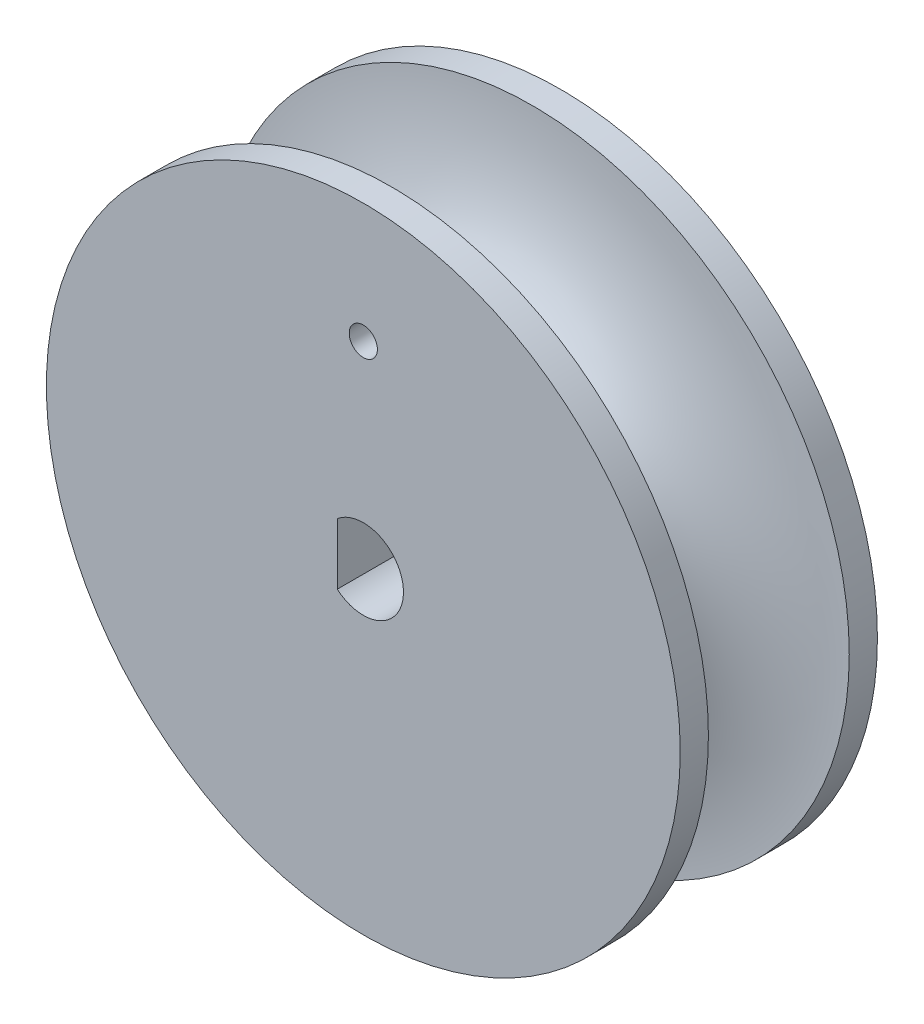
ISO-10303-21;
HEADER;
FILE_DESCRIPTION(('STEP AP214'),'2;1');
FILE_NAME('part.step','',(''),(''),'','','');
FILE_SCHEMA(('AUTOMOTIVE_DESIGN { 1 0 10303 214 1 1 1 1 }'));
ENDSEC;
DATA;
#1=APPLICATION_CONTEXT('core data for automotive mechanical design processes');
#2=APPLICATION_PROTOCOL_DEFINITION('international standard','automotive_design',2000,#1);
#3=PRODUCT_CONTEXT('',#1,'mechanical');
#4=PRODUCT('Part','Part','',(#3));
#5=PRODUCT_RELATED_PRODUCT_CATEGORY('part','',(#4));
#6=PRODUCT_DEFINITION_FORMATION('','',#4);
#7=PRODUCT_DEFINITION_CONTEXT('part definition',#1,'design');
#8=PRODUCT_DEFINITION('design','',#6,#7);
#9=PRODUCT_DEFINITION_SHAPE('','',#8);
#10=(LENGTH_UNIT() NAMED_UNIT(*) SI_UNIT(.MILLI.,.METRE.));
#11=(NAMED_UNIT(*) PLANE_ANGLE_UNIT() SI_UNIT($,.RADIAN.));
#12=(NAMED_UNIT(*) SI_UNIT($,.STERADIAN.) SOLID_ANGLE_UNIT());
#13=UNCERTAINTY_MEASURE_WITH_UNIT(LENGTH_MEASURE(1.E-05),#10,'distance_accuracy_value','');
#14=(GEOMETRIC_REPRESENTATION_CONTEXT(3) GLOBAL_UNCERTAINTY_ASSIGNED_CONTEXT((#13)) GLOBAL_UNIT_ASSIGNED_CONTEXT((#10,
#11,#12)) REPRESENTATION_CONTEXT('',''));
#15=CARTESIAN_POINT('',(0.,0.,0.));
#16=DIRECTION('',(0.,0.,1.));
#17=DIRECTION('',(1.,0.,0.));
#18=AXIS2_PLACEMENT_3D('',#15,#16,#17);
#19=CARTESIAN_POINT('',(0.,11.25,0.));
#20=DIRECTION('',(1.,0.,0.));
#21=DIRECTION('',(0.,-1.,0.));
#22=AXIS2_PLACEMENT_3D('',#19,#20,#21);
#23=ELLIPSE('',#22,5.56017002713572,2.5);
#24=CARTESIAN_POINT('',(0.,0.,0.));
#25=DIRECTION('',(0.,0.,1.));
#26=AXIS1_PLACEMENT('',#24,#25);
#27=SURFACE_OF_REVOLUTION('',#23,#26);
#28=CARTESIAN_POINT('',(0.,7.5,1.84582459000551));
#29=CARTESIAN_POINT('',(0.0266433993116358,7.50000081042951,1.84582480569695));
#30=CARTESIAN_POINT('',(0.0532813147082898,7.49786382528039,1.84500720996573));
#31=CARTESIAN_POINT('',(0.105782655208025,7.48940445309467,1.84175238004027));
#32=CARTESIAN_POINT('',(0.131646090044294,7.48308211868001,1.8393151662093));
#33=CARTESIAN_POINT('',(0.181838705711033,7.46651110117882,1.83286868522541));
#34=CARTESIAN_POINT('',(0.206169533861391,7.45626672055202,1.82886114060257));
#35=CARTESIAN_POINT('',(0.252693480211035,7.43224030494666,1.81934510771196));
#36=CARTESIAN_POINT('',(0.27488636474416,7.41845788388052,1.81383645563226));
#37=CARTESIAN_POINT('',(0.317064411951136,7.3875164283066,1.8012786205608));
#38=CARTESIAN_POINT('',(0.336991444652016,7.37029081124449,1.79419869567248));
#39=CARTESIAN_POINT('',(0.37368312969913,7.33323008550664,1.77868413882093));
#40=CARTESIAN_POINT('',(0.39044292850908,7.31339104966319,1.77024746377965));
#41=CARTESIAN_POINT('',(0.42139068331674,7.27049978745321,1.75162696194601));
#42=CARTESIAN_POINT('',(0.435365980881088,7.24732655551486,1.74136899879944));
#43=CARTESIAN_POINT('',(0.459277988436934,7.19945322584038,1.71966271912894));
#44=CARTESIAN_POINT('',(0.469206980927311,7.17475031291808,1.70821217972811));
#45=CARTESIAN_POINT('',(0.485610668445849,7.12244988308553,1.68334052055877));
#46=CARTESIAN_POINT('',(0.491731869511655,7.09478191325371,1.66983474861555));
#47=CARTESIAN_POINT('',(0.499245127053054,7.03925014927329,1.64192937204318));
#48=CARTESIAN_POINT('',(0.500634140838279,7.01138624067196,1.62752919838946));
#49=CARTESIAN_POINT('',(0.498755032982155,6.95357366794553,1.59674902103355));
#50=CARTESIAN_POINT('',(0.495043466628602,6.92367105931214,1.58030920278715));
#51=CARTESIAN_POINT('',(0.482419149181278,6.86522035584641,1.54710727561686));
#52=CARTESIAN_POINT('',(0.473511044265179,6.83667107563884,1.53034546751123));
#53=CARTESIAN_POINT('',(0.449947232104092,6.77962438766472,1.49576230325799));
#54=CARTESIAN_POINT('',(0.434934315279015,6.75126918131093,1.47794849244152));
#55=CARTESIAN_POINT('',(0.399487771973891,6.69760489771167,1.4431207760738));
#56=CARTESIAN_POINT('',(0.37905627244121,6.67229463089539,1.42610655973722));
#57=CARTESIAN_POINT('',(0.337382472290781,6.63002780371952,1.39685412781892));
#58=CARTESIAN_POINT('',(0.317028700218373,6.61239728553011,1.38432207608653));
#59=CARTESIAN_POINT('',(0.273052699887464,6.58025895792246,1.36100304089051));
#60=CARTESIAN_POINT('',(0.249430050141017,6.56575155181469,1.35021628285414));
#61=CARTESIAN_POINT('',(0.203731377204477,6.54280610139985,1.33288261762763));
#62=CARTESIAN_POINT('',(0.182124702133387,6.53374787137695,1.32592301046383));
#63=CARTESIAN_POINT('',(0.137351386765886,6.51865778650098,1.31422239592763));
#64=CARTESIAN_POINT('',(0.114188775346534,6.51261843318679,1.30947589351093));
#65=CARTESIAN_POINT('',(0.0666927979134416,6.50387667434913,1.30257694998279));
#66=CARTESIAN_POINT('',(0.0423527673460878,6.50119634495349,1.30044167251958));
#67=CARTESIAN_POINT('',(-0.00653741337433114,6.49944523052383,1.29904878310457));
#68=CARTESIAN_POINT('',(-0.0310875016309571,6.50037341641818,1.29979035073774));
#69=CARTESIAN_POINT('',(-0.0772653802352223,6.50551155007232,1.30386606562926));
#70=CARTESIAN_POINT('',(-0.0989518482678199,6.50940667508526,1.30695143155617));
#71=CARTESIAN_POINT('',(-0.141280839223496,6.51987799006217,1.31516379506682));
#72=CARTESIAN_POINT('',(-0.161921681379705,6.52645835165488,1.32029396905699));
#73=CARTESIAN_POINT('',(-0.223945216462041,6.55068343695664,1.33893013618493));
#74=CARTESIAN_POINT('',(-0.262851107961896,6.57249220776175,1.35540413102411));
#75=CARTESIAN_POINT('',(-0.338693272364989,6.62862590646877,1.39605149934613));
#76=CARTESIAN_POINT('',(-0.373968477452519,6.6645102954645,1.42108192499402));
#77=CARTESIAN_POINT('',(-0.42031593667924,6.72762117290725,1.46275554018283));
#78=CARTESIAN_POINT('',(-0.435412025152841,6.75250432991312,1.47871099154578));
#79=CARTESIAN_POINT('',(-0.461058173349919,6.80439163923392,1.51093526333657));
#80=CARTESIAN_POINT('',(-0.471603847363197,6.83139780822052,1.52720437036442));
#81=CARTESIAN_POINT('',(-0.488747927899165,6.889794929302,1.56126694213348));
#82=CARTESIAN_POINT('',(-0.494823481212786,6.92135014429602,1.57904349465183));
#83=CARTESIAN_POINT('',(-0.500816410411038,6.98536956731168,1.61387460345129));
#84=CARTESIAN_POINT('',(-0.500744573119194,7.01783208320283,1.63093037186162));
#85=CARTESIAN_POINT('',(-0.494227877150783,7.082317707148,1.66370852966755));
#86=CARTESIAN_POINT('',(-0.487859046173471,7.11434143777918,1.67944439697287));
#87=CARTESIAN_POINT('',(-0.468708656906506,7.17716882126095,1.70939777929881));
#88=CARTESIAN_POINT('',(-0.455930453423234,7.2079731033064,1.72361608392814));
#89=CARTESIAN_POINT('',(-0.42540493649301,7.26452655462721,1.74903036812389));
#90=CARTESIAN_POINT('',(-0.40817064970566,7.29048288835724,1.76038037568682));
#91=CARTESIAN_POINT('',(-0.368717847950646,7.33915531321342,1.78122177039132));
#92=CARTESIAN_POINT('',(-0.3465029317364,7.36187372460973,1.79071449028784));
#93=CARTESIAN_POINT('',(-0.300092391948866,7.40096575684272,1.80677903046868));
#94=CARTESIAN_POINT('',(-0.276303697785406,7.41774282044512,1.81354584169909));
#95=CARTESIAN_POINT('',(-0.225826428260989,7.44704925692056,1.82523485319365));
#96=CARTESIAN_POINT('',(-0.199138689201276,7.45957985051852,1.83015758361527));
#97=CARTESIAN_POINT('',(-0.144190601610235,7.47963537558859,1.83798295617767));
#98=CARTESIAN_POINT('',(-0.115964828793625,7.48724201928022,1.84091861315374));
#99=CARTESIAN_POINT('',(-0.0584902890118176,7.49742310772312,1.84483900968423));
#100=CARTESIAN_POINT('',(-0.0292418416403844,7.49999911053199,1.84582435327839));
#101=CARTESIAN_POINT('',(0.,7.5,1.84582459000551));
#102=B_SPLINE_CURVE_WITH_KNOTS('',3,(#28,#29,#30,#31,#32,#33,#34,#35,#36,#37,#38,#39,#40,#41,
#42,#43,#44,#45,#46,#47,#48,#49,#50,#51,#52,#53,#54,#55,#56,#57,#58,#59,#60,#61,#62,#63,#64,#65,
#66,#67,#68,#69,#70,#71,#72,#73,#74,#75,#76,#77,#78,#79,#80,#81,#82,#83,#84,#85,#86,#87,#88,#89,
#90,#91,#92,#93,#94,#95,#96,#97,#98,#99,#100,#101),.UNSPECIFIED.,.T.,.F.,(4,2,2,2,2,2,2,2,2,2,2,
2,2,2,2,2,2,2,2,2,2,2,2,2,2,2,2,2,2,2,2,2,2,2,2,2,4),(0.,0.0798239592816616,0.159646914964312,
0.23938255512146,0.319126900107399,0.400595960581847,0.482188871184872,0.568641917635808,
0.655259092478596,0.749038085187237,0.842877364318114,0.945411574219749,1.04785424942512,
1.15743440715237,1.26697161506061,1.35573639831282,1.44451263754832,1.51753611568703,
1.5903773012202,1.66369474392616,1.73699127959427,1.80343748304369,1.86998730887563,
2.01058925366561,2.17690146812921,2.27615279903671,2.37549957631495,2.48515050365276,
2.59460903050984,2.70276193469571,2.81085828825723,2.90979174356309,3.00865394357625,
3.0978359523759,3.18699230239737,3.27462837394718,3.36223729911175),.UNSPECIFIED.);
#103=CARTESIAN_POINT('',(0.,7.5,1.84582459000551));
#104=VERTEX_POINT('',#103);
#105=EDGE_CURVE('E82',#104,#104,#102,.T.);
#106=ORIENTED_EDGE('',*,*,#105,.F.);
#107=EDGE_LOOP('',(#106));
#108=FACE_BOUND('',#107,.T.);
#109=CARTESIAN_POINT('',(0.,0.,-2.5));
#110=DIRECTION('',(0.,0.,1.));
#111=DIRECTION('',(1.,0.,0.));
#112=AXIS2_PLACEMENT_3D('',#109,#110,#111);
#113=CIRCLE('',#112,11.25);
#114=CARTESIAN_POINT('',(11.25,0.,-2.5));
#115=VERTEX_POINT('',#114);
#116=EDGE_CURVE('E103',#115,#115,#113,.T.);
#117=ORIENTED_EDGE('',*,*,#116,.T.);
#118=EDGE_LOOP('',(#117));
#119=FACE_BOUND('',#118,.T.);
#120=CARTESIAN_POINT('',(0.,0.,2.5));
#121=DIRECTION('',(0.,0.,1.));
#122=DIRECTION('',(1.,0.,0.));
#123=AXIS2_PLACEMENT_3D('',#120,#121,#122);
#124=CIRCLE('',#123,11.25);
#125=CARTESIAN_POINT('',(11.25,0.,2.5));
#126=VERTEX_POINT('',#125);
#127=EDGE_CURVE('E11',#126,#126,#124,.T.);
#128=ORIENTED_EDGE('',*,*,#127,.F.);
#129=EDGE_LOOP('',(#128));
#130=FACE_BOUND('',#129,.T.);
#131=ADVANCED_FACE('F45',(#108,#119,#130),#27,.F.);
#132=CARTESIAN_POINT('',(0.,0.,0.));
#133=DIRECTION('',(0.,0.,1.));
#134=DIRECTION('',(1.,0.,0.));
#135=AXIS2_PLACEMENT_3D('',#132,#133,#134);
#136=CYLINDRICAL_SURFACE('',#135,11.25);
#137=ORIENTED_EDGE('',*,*,#127,.T.);
#138=EDGE_LOOP('',(#137));
#139=FACE_BOUND('',#138,.T.);
#140=CARTESIAN_POINT('',(0.,0.,3.5));
#141=DIRECTION('',(0.,0.,1.));
#142=DIRECTION('',(1.,0.,0.));
#143=AXIS2_PLACEMENT_3D('',#140,#141,#142);
#144=CIRCLE('',#143,11.25);
#145=CARTESIAN_POINT('',(11.25,0.,3.5));
#146=VERTEX_POINT('',#145);
#147=EDGE_CURVE('E55',#146,#146,#144,.T.);
#148=ORIENTED_EDGE('',*,*,#147,.F.);
#149=EDGE_LOOP('',(#148));
#150=FACE_BOUND('',#149,.T.);
#151=ADVANCED_FACE('F132',(#139,#150),#136,.T.);
#152=CARTESIAN_POINT('',(0.,0.,3.5));
#153=DIRECTION('',(0.,0.,-1.));
#154=DIRECTION('',(-1.,0.,0.));
#155=AXIS2_PLACEMENT_3D('',#152,#153,#154);
#156=PLANE('',#155);
#157=CARTESIAN_POINT('',(0.,7.,3.5));
#158=DIRECTION('',(0.,0.,1.));
#159=DIRECTION('',(1.,0.,0.));
#160=AXIS2_PLACEMENT_3D('',#157,#158,#159);
#161=CIRCLE('',#160,0.5);
#162=CARTESIAN_POINT('',(0.5,7.,3.5));
#163=VERTEX_POINT('',#162);
#164=EDGE_CURVE('E119',#163,#163,#161,.T.);
#165=ORIENTED_EDGE('',*,*,#164,.F.);
#166=EDGE_LOOP('',(#165));
#167=FACE_BOUND('',#166,.T.);
#168=CARTESIAN_POINT('',(0.,0.,3.5));
#169=DIRECTION('',(0.,0.,1.));
#170=DIRECTION('',(1.,0.,0.));
#171=AXIS2_PLACEMENT_3D('',#168,#169,#170);
#172=CIRCLE('',#171,1.425);
#173=CARTESIAN_POINT('',(-0.925000000000001,-1.08397416943394,3.5));
#174=VERTEX_POINT('',#173);
#175=CARTESIAN_POINT('',(-0.925000000000001,1.08397416943394,3.5));
#176=VERTEX_POINT('',#175);
#177=EDGE_CURVE('E86',#174,#176,#172,.T.);
#178=ORIENTED_EDGE('',*,*,#177,.F.);
#179=DIRECTION('',(0.,1.,0.));
#180=VECTOR('',#179,1.);
#181=CARTESIAN_POINT('',(-0.925000000000001,1.08397416943394,3.5));
#182=LINE('',#181,#180);
#183=EDGE_CURVE('E72',#174,#176,#182,.T.);
#184=ORIENTED_EDGE('',*,*,#183,.T.);
#185=EDGE_LOOP('',(#178,#184));
#186=FACE_BOUND('',#185,.T.);
#187=ORIENTED_EDGE('',*,*,#147,.T.);
#188=EDGE_LOOP('',(#187));
#189=FACE_BOUND('',#188,.T.);
#190=ADVANCED_FACE('F90',(#167,#186,#189),#156,.F.);
#191=CARTESIAN_POINT('',(0.,0.,0.));
#192=DIRECTION('',(0.,0.,1.));
#193=DIRECTION('',(1.,0.,0.));
#194=AXIS2_PLACEMENT_3D('',#191,#192,#193);
#195=CYLINDRICAL_SURFACE('',#194,1.425);
#196=ORIENTED_EDGE('',*,*,#177,.T.);
#197=DIRECTION('',(0.,0.,1.));
#198=VECTOR('',#197,1.);
#199=CARTESIAN_POINT('',(-0.925000000000001,1.08397416943394,-3.5));
#200=LINE('',#199,#198);
#201=CARTESIAN_POINT('',(-0.925000000000001,1.08397416943394,-3.5));
#202=VERTEX_POINT('',#201);
#203=EDGE_CURVE('E77',#202,#176,#200,.T.);
#204=ORIENTED_EDGE('',*,*,#203,.F.);
#205=CARTESIAN_POINT('',(0.,0.,-3.5));
#206=DIRECTION('',(0.,0.,1.));
#207=DIRECTION('',(1.,0.,0.));
#208=AXIS2_PLACEMENT_3D('',#205,#206,#207);
#209=CIRCLE('',#208,1.425);
#210=CARTESIAN_POINT('',(-0.925000000000001,-1.08397416943394,-3.5));
#211=VERTEX_POINT('',#210);
#212=EDGE_CURVE('E87',#211,#202,#209,.T.);
#213=ORIENTED_EDGE('',*,*,#212,.F.);
#214=DIRECTION('',(0.,0.,1.));
#215=VECTOR('',#214,1.);
#216=CARTESIAN_POINT('',(-0.925000000000001,-1.08397416943394,-3.5));
#217=LINE('',#216,#215);
#218=EDGE_CURVE('E75',#211,#174,#217,.T.);
#219=ORIENTED_EDGE('',*,*,#218,.T.);
#220=EDGE_LOOP('',(#196,#204,#213,#219));
#221=FACE_BOUND('',#220,.T.);
#222=ADVANCED_FACE('F85',(#221),#195,.F.);
#223=CARTESIAN_POINT('',(0.,0.,-3.5));
#224=DIRECTION('',(0.,0.,-1.));
#225=DIRECTION('',(-1.,0.,0.));
#226=AXIS2_PLACEMENT_3D('',#223,#224,#225);
#227=PLANE('',#226);
#228=ORIENTED_EDGE('',*,*,#212,.T.);
#229=DIRECTION('',(0.,1.,0.));
#230=VECTOR('',#229,1.);
#231=CARTESIAN_POINT('',(-0.925000000000001,1.08397416943394,-3.5));
#232=LINE('',#231,#230);
#233=EDGE_CURVE('E61',#211,#202,#232,.T.);
#234=ORIENTED_EDGE('',*,*,#233,.F.);
#235=EDGE_LOOP('',(#228,#234));
#236=FACE_BOUND('',#235,.T.);
#237=CARTESIAN_POINT('',(0.,0.,-3.5));
#238=DIRECTION('',(0.,0.,1.));
#239=DIRECTION('',(1.,0.,0.));
#240=AXIS2_PLACEMENT_3D('',#237,#238,#239);
#241=CIRCLE('',#240,11.25);
#242=CARTESIAN_POINT('',(11.25,0.,-3.5));
#243=VERTEX_POINT('',#242);
#244=EDGE_CURVE('E97',#243,#243,#241,.T.);
#245=ORIENTED_EDGE('',*,*,#244,.F.);
#246=EDGE_LOOP('',(#245));
#247=FACE_BOUND('',#246,.T.);
#248=ADVANCED_FACE('F130',(#236,#247),#227,.T.);
#249=ORIENTED_EDGE('',*,*,#244,.T.);
#250=EDGE_LOOP('',(#249));
#251=FACE_BOUND('',#250,.T.);
#252=ORIENTED_EDGE('',*,*,#116,.F.);
#253=EDGE_LOOP('',(#252));
#254=FACE_BOUND('',#253,.T.);
#255=ADVANCED_FACE('F127',(#251,#254),#136,.T.);
#256=CARTESIAN_POINT('',(-0.925000000000001,1.08397416943394,-3.5));
#257=DIRECTION('',(1.,0.,0.));
#258=DIRECTION('',(0.,0.,-1.));
#259=AXIS2_PLACEMENT_3D('',#256,#257,#258);
#260=PLANE('',#259);
#261=ORIENTED_EDGE('',*,*,#183,.F.);
#262=ORIENTED_EDGE('',*,*,#218,.F.);
#263=ORIENTED_EDGE('',*,*,#233,.T.);
#264=ORIENTED_EDGE('',*,*,#203,.T.);
#265=EDGE_LOOP('',(#261,#262,#263,#264));
#266=FACE_BOUND('',#265,.T.);
#267=ADVANCED_FACE('F74',(#266),#260,.T.);
#268=CARTESIAN_POINT('',(0.,7.,0.500000000000001));
#269=DIRECTION('',(0.,0.,1.));
#270=DIRECTION('',(1.,0.,0.));
#271=AXIS2_PLACEMENT_3D('',#268,#269,#270);
#272=CYLINDRICAL_SURFACE('',#271,0.5);
#273=ORIENTED_EDGE('',*,*,#105,.T.);
#274=EDGE_LOOP('',(#273));
#275=FACE_BOUND('',#274,.T.);
#276=ORIENTED_EDGE('',*,*,#164,.T.);
#277=EDGE_LOOP('',(#276));
#278=FACE_BOUND('',#277,.T.);
#279=ADVANCED_FACE('F120',(#275,#278),#272,.F.);
#280=CLOSED_SHELL('',(#131,#151,#190,#222,#248,#255,#267,#279));
#281=MANIFOLD_SOLID_BREP('B2',#280);
#282=ADVANCED_BREP_SHAPE_REPRESENTATION('',(#18,#281),#14);
#283=SHAPE_DEFINITION_REPRESENTATION(#9,#282);
ENDSEC;
END-ISO-10303-21;
